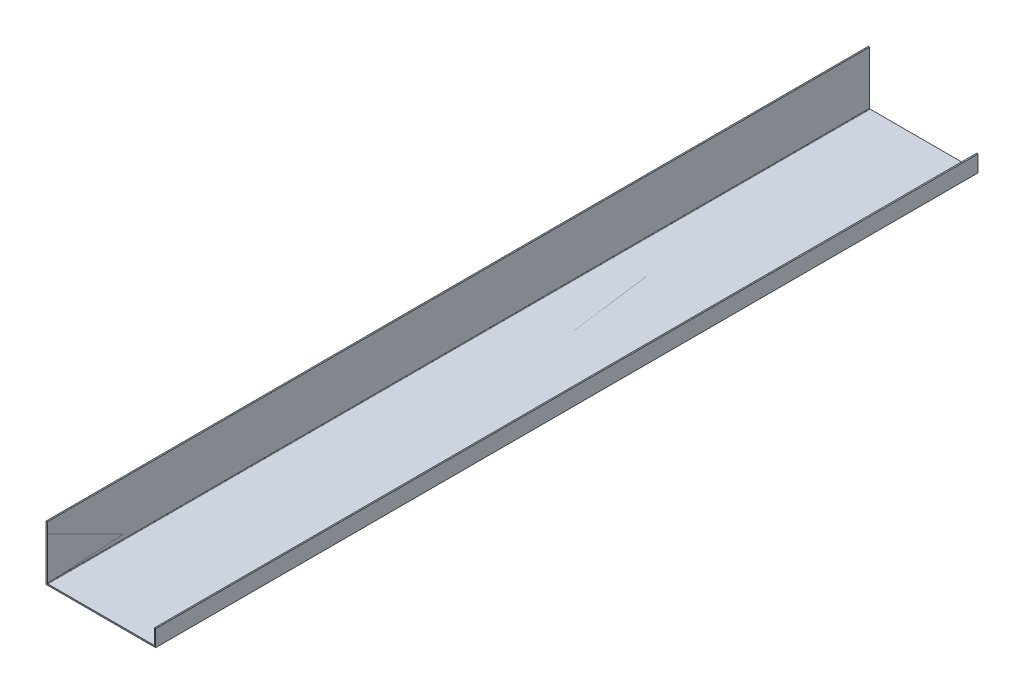
ISO-10303-21;
HEADER;
FILE_DESCRIPTION(('STEP AP214'),'2;1');
FILE_NAME('part.step','',(''),(''),'','','');
FILE_SCHEMA(('AUTOMOTIVE_DESIGN { 1 0 10303 214 1 1 1 1 }'));
ENDSEC;
DATA;
#1=APPLICATION_CONTEXT('core data for automotive mechanical design processes');
#2=APPLICATION_PROTOCOL_DEFINITION('international standard','automotive_design',2000,#1);
#3=PRODUCT_CONTEXT('',#1,'mechanical');
#4=PRODUCT('Part','Part','',(#3));
#5=PRODUCT_RELATED_PRODUCT_CATEGORY('part','',(#4));
#6=PRODUCT_DEFINITION_FORMATION('','',#4);
#7=PRODUCT_DEFINITION_CONTEXT('part definition',#1,'design');
#8=PRODUCT_DEFINITION('design','',#6,#7);
#9=PRODUCT_DEFINITION_SHAPE('','',#8);
#10=(LENGTH_UNIT() NAMED_UNIT(*) SI_UNIT(.MILLI.,.METRE.));
#11=(NAMED_UNIT(*) PLANE_ANGLE_UNIT() SI_UNIT($,.RADIAN.));
#12=(NAMED_UNIT(*) SI_UNIT($,.STERADIAN.) SOLID_ANGLE_UNIT());
#13=UNCERTAINTY_MEASURE_WITH_UNIT(LENGTH_MEASURE(1.E-05),#10,'distance_accuracy_value','');
#14=(GEOMETRIC_REPRESENTATION_CONTEXT(3) GLOBAL_UNCERTAINTY_ASSIGNED_CONTEXT((#13)) GLOBAL_UNIT_ASSIGNED_CONTEXT((#10,
#11,#12)) REPRESENTATION_CONTEXT('',''));
#15=CARTESIAN_POINT('',(0.,0.,0.));
#16=DIRECTION('',(0.,0.,1.));
#17=DIRECTION('',(1.,0.,0.));
#18=AXIS2_PLACEMENT_3D('',#15,#16,#17);
#19=CARTESIAN_POINT('',(1.2,1.19999999999999,0.));
#20=DIRECTION('',(0.,0.,1.));
#21=DIRECTION('',(-1.,0.,0.));
#22=AXIS2_PLACEMENT_3D('',#19,#20,#21);
#23=PLANE('',#22);
#24=DIRECTION('',(0.,1.,0.));
#25=VECTOR('',#24,1.);
#26=CARTESIAN_POINT('',(98.3,1.19999999999999,0.));
#27=LINE('',#26,#25);
#28=CARTESIAN_POINT('',(98.3,0.199999999999988,0.));
#29=VERTEX_POINT('',#28);
#30=CARTESIAN_POINT('',(98.3,1.19999999999999,0.));
#31=VERTEX_POINT('',#30);
#32=EDGE_CURVE('E12',#29,#31,#27,.T.);
#33=ORIENTED_EDGE('',*,*,#32,.F.);
#34=DIRECTION('',(1.,0.,0.));
#35=VECTOR('',#34,1.);
#36=CARTESIAN_POINT('',(1.2,0.199999999999988,0.));
#37=LINE('',#36,#35);
#38=CARTESIAN_POINT('',(1.7,0.199999999999988,0.));
#39=VERTEX_POINT('',#38);
#40=EDGE_CURVE('E105',#29,#39,#37,.F.);
#41=ORIENTED_EDGE('',*,*,#40,.T.);
#42=DIRECTION('',(0.,1.,0.));
#43=VECTOR('',#42,1.);
#44=CARTESIAN_POINT('',(1.7,1.19999999999999,0.));
#45=LINE('',#44,#43);
#46=CARTESIAN_POINT('',(1.7,1.19999999999999,0.));
#47=VERTEX_POINT('',#46);
#48=EDGE_CURVE('E58',#39,#47,#45,.T.);
#49=ORIENTED_EDGE('',*,*,#48,.T.);
#50=DIRECTION('',(-1.,0.,0.));
#51=VECTOR('',#50,1.);
#52=CARTESIAN_POINT('',(1.2,1.19999999999999,0.));
#53=LINE('',#52,#51);
#54=EDGE_CURVE('E107',#31,#47,#53,.T.);
#55=ORIENTED_EDGE('',*,*,#54,.F.);
#56=EDGE_LOOP('',(#33,#41,#49,#55));
#57=FACE_BOUND('',#56,.T.);
#58=ADVANCED_FACE('F48',(#57),#23,.F.);
#59=CARTESIAN_POINT('',(1.7,1.69999999999999,0.));
#60=DIRECTION('',(0.,0.,-1.));
#61=DIRECTION('',(-1.,0.,0.));
#62=AXIS2_PLACEMENT_3D('',#59,#60,#61);
#63=PLANE('',#62);
#64=ORIENTED_EDGE('',*,*,#48,.F.);
#65=CARTESIAN_POINT('',(1.7,1.69999999999999,0.));
#66=DIRECTION('',(0.,0.,1.));
#67=DIRECTION('',(1.,0.,0.));
#68=AXIS2_PLACEMENT_3D('',#65,#66,#67);
#69=CIRCLE('',#68,1.5);
#70=CARTESIAN_POINT('',(0.200000000000003,1.69999999999999,0.));
#71=VERTEX_POINT('',#70);
#72=EDGE_CURVE('E146',#39,#71,#69,.F.);
#73=ORIENTED_EDGE('',*,*,#72,.T.);
#74=DIRECTION('',(1.,0.,0.));
#75=VECTOR('',#74,1.);
#76=CARTESIAN_POINT('',(1.2,1.69999999999999,0.));
#77=LINE('',#76,#75);
#78=CARTESIAN_POINT('',(1.2,1.69999999999999,0.));
#79=VERTEX_POINT('',#78);
#80=EDGE_CURVE('E173',#71,#79,#77,.T.);
#81=ORIENTED_EDGE('',*,*,#80,.T.);
#82=CARTESIAN_POINT('',(1.7,1.69999999999999,0.));
#83=DIRECTION('',(0.,0.,1.));
#84=DIRECTION('',(1.,0.,0.));
#85=AXIS2_PLACEMENT_3D('',#82,#83,#84);
#86=CIRCLE('',#85,0.5);
#87=EDGE_CURVE('E182',#47,#79,#86,.F.);
#88=ORIENTED_EDGE('',*,*,#87,.F.);
#89=EDGE_LOOP('',(#64,#73,#81,#88));
#90=FACE_BOUND('',#89,.T.);
#91=ADVANCED_FACE('F181',(#90),#63,.T.);
#92=CARTESIAN_POINT('',(1.2,50.,0.));
#93=DIRECTION('',(0.,0.,1.));
#94=DIRECTION('',(0.,1.,0.));
#95=AXIS2_PLACEMENT_3D('',#92,#93,#94);
#96=PLANE('',#95);
#97=ORIENTED_EDGE('',*,*,#80,.F.);
#98=DIRECTION('',(0.,-1.,0.));
#99=VECTOR('',#98,1.);
#100=CARTESIAN_POINT('',(0.2,50.,0.));
#101=LINE('',#100,#99);
#102=CARTESIAN_POINT('',(0.2,50.,0.));
#103=VERTEX_POINT('',#102);
#104=EDGE_CURVE('E143',#71,#103,#101,.F.);
#105=ORIENTED_EDGE('',*,*,#104,.T.);
#106=DIRECTION('',(1.,0.,0.));
#107=VECTOR('',#106,1.);
#108=CARTESIAN_POINT('',(1.2,50.,0.));
#109=LINE('',#108,#107);
#110=CARTESIAN_POINT('',(1.2,50.,0.));
#111=VERTEX_POINT('',#110);
#112=EDGE_CURVE('E170',#103,#111,#109,.T.);
#113=ORIENTED_EDGE('',*,*,#112,.T.);
#114=DIRECTION('',(0.,1.,0.));
#115=VECTOR('',#114,1.);
#116=CARTESIAN_POINT('',(1.2,50.,0.));
#117=LINE('',#116,#115);
#118=EDGE_CURVE('E201',#79,#111,#117,.T.);
#119=ORIENTED_EDGE('',*,*,#118,.F.);
#120=EDGE_LOOP('',(#97,#105,#113,#119));
#121=FACE_BOUND('',#120,.T.);
#122=ADVANCED_FACE('F202',(#121),#96,.F.);
#123=CARTESIAN_POINT('',(1.2,50.,750.));
#124=DIRECTION('',(0.,1.,0.));
#125=DIRECTION('',(0.,0.,-1.));
#126=AXIS2_PLACEMENT_3D('',#123,#124,#125);
#127=PLANE('',#126);
#128=ORIENTED_EDGE('',*,*,#112,.F.);
#129=DIRECTION('',(0.,0.,1.));
#130=VECTOR('',#129,1.);
#131=CARTESIAN_POINT('',(0.2,50.,750.));
#132=LINE('',#131,#130);
#133=CARTESIAN_POINT('',(0.2,50.,750.));
#134=VERTEX_POINT('',#133);
#135=EDGE_CURVE('E239',#134,#103,#132,.F.);
#136=ORIENTED_EDGE('',*,*,#135,.F.);
#137=DIRECTION('',(1.,0.,0.));
#138=VECTOR('',#137,1.);
#139=CARTESIAN_POINT('',(1.2,50.,750.));
#140=LINE('',#139,#138);
#141=CARTESIAN_POINT('',(1.2,50.,750.));
#142=VERTEX_POINT('',#141);
#143=EDGE_CURVE('E167',#134,#142,#140,.T.);
#144=ORIENTED_EDGE('',*,*,#143,.T.);
#145=DIRECTION('',(0.,0.,-1.));
#146=VECTOR('',#145,1.);
#147=CARTESIAN_POINT('',(1.2,50.,750.));
#148=LINE('',#147,#146);
#149=EDGE_CURVE('E206',#142,#111,#148,.T.);
#150=ORIENTED_EDGE('',*,*,#149,.T.);
#151=EDGE_LOOP('',(#128,#136,#144,#150));
#152=FACE_BOUND('',#151,.T.);
#153=ADVANCED_FACE('F250',(#152),#127,.T.);
#154=CARTESIAN_POINT('',(1.2,50.,750.));
#155=DIRECTION('',(0.,0.,1.));
#156=DIRECTION('',(0.,1.,0.));
#157=AXIS2_PLACEMENT_3D('',#154,#155,#156);
#158=PLANE('',#157);
#159=ORIENTED_EDGE('',*,*,#143,.F.);
#160=DIRECTION('',(0.,-1.,0.));
#161=VECTOR('',#160,1.);
#162=CARTESIAN_POINT('',(0.2,50.,750.));
#163=LINE('',#162,#161);
#164=CARTESIAN_POINT('',(0.200000000000003,1.69999999999999,750.));
#165=VERTEX_POINT('',#164);
#166=EDGE_CURVE('E136',#165,#134,#163,.F.);
#167=ORIENTED_EDGE('',*,*,#166,.F.);
#168=DIRECTION('',(1.,0.,0.));
#169=VECTOR('',#168,1.);
#170=CARTESIAN_POINT('',(1.2,1.69999999999999,750.));
#171=LINE('',#170,#169);
#172=CARTESIAN_POINT('',(1.2,1.69999999999999,750.));
#173=VERTEX_POINT('',#172);
#174=EDGE_CURVE('E164',#165,#173,#171,.T.);
#175=ORIENTED_EDGE('',*,*,#174,.T.);
#176=DIRECTION('',(0.,1.,0.));
#177=VECTOR('',#176,1.);
#178=CARTESIAN_POINT('',(1.2,50.,750.));
#179=LINE('',#178,#177);
#180=EDGE_CURVE('E212',#173,#142,#179,.T.);
#181=ORIENTED_EDGE('',*,*,#180,.T.);
#182=EDGE_LOOP('',(#159,#167,#175,#181));
#183=FACE_BOUND('',#182,.T.);
#184=ADVANCED_FACE('F300',(#183),#158,.T.);
#185=CARTESIAN_POINT('',(1.7,1.69999999999999,750.));
#186=DIRECTION('',(0.,0.,1.));
#187=DIRECTION('',(1.,0.,0.));
#188=AXIS2_PLACEMENT_3D('',#185,#186,#187);
#189=PLANE('',#188);
#190=ORIENTED_EDGE('',*,*,#174,.F.);
#191=CARTESIAN_POINT('',(1.7,1.69999999999999,750.));
#192=DIRECTION('',(0.,0.,1.));
#193=DIRECTION('',(1.,0.,0.));
#194=AXIS2_PLACEMENT_3D('',#191,#192,#193);
#195=CIRCLE('',#194,1.5);
#196=CARTESIAN_POINT('',(1.7,0.199999999999986,750.));
#197=VERTEX_POINT('',#196);
#198=EDGE_CURVE('E141',#165,#197,#195,.T.);
#199=ORIENTED_EDGE('',*,*,#198,.T.);
#200=DIRECTION('',(0.,1.,0.));
#201=VECTOR('',#200,1.);
#202=CARTESIAN_POINT('',(1.7,1.19999999999999,750.));
#203=LINE('',#202,#201);
#204=CARTESIAN_POINT('',(1.7,1.19999999999999,750.));
#205=VERTEX_POINT('',#204);
#206=EDGE_CURVE('E162',#197,#205,#203,.T.);
#207=ORIENTED_EDGE('',*,*,#206,.T.);
#208=CARTESIAN_POINT('',(1.7,1.69999999999999,750.));
#209=DIRECTION('',(0.,0.,-1.));
#210=DIRECTION('',(-1.,0.,0.));
#211=AXIS2_PLACEMENT_3D('',#208,#209,#210);
#212=CIRCLE('',#211,0.5);
#213=EDGE_CURVE('E198',#173,#205,#212,.F.);
#214=ORIENTED_EDGE('',*,*,#213,.F.);
#215=EDGE_LOOP('',(#190,#199,#207,#214));
#216=FACE_BOUND('',#215,.T.);
#217=ADVANCED_FACE('F302',(#216),#189,.T.);
#218=CARTESIAN_POINT('',(1.2,1.19999999999999,750.));
#219=DIRECTION('',(0.,0.,1.));
#220=DIRECTION('',(-1.,0.,0.));
#221=AXIS2_PLACEMENT_3D('',#218,#219,#220);
#222=PLANE('',#221);
#223=ORIENTED_EDGE('',*,*,#206,.F.);
#224=DIRECTION('',(1.,0.,0.));
#225=VECTOR('',#224,1.);
#226=CARTESIAN_POINT('',(1.2,0.199999999999988,750.));
#227=LINE('',#226,#225);
#228=CARTESIAN_POINT('',(98.3,0.199999999999988,750.));
#229=VERTEX_POINT('',#228);
#230=EDGE_CURVE('E135',#229,#197,#227,.F.);
#231=ORIENTED_EDGE('',*,*,#230,.F.);
#232=DIRECTION('',(0.,1.,0.));
#233=VECTOR('',#232,1.);
#234=CARTESIAN_POINT('',(98.3,1.19999999999999,750.));
#235=LINE('',#234,#233);
#236=CARTESIAN_POINT('',(98.3,1.19999999999999,750.));
#237=VERTEX_POINT('',#236);
#238=EDGE_CURVE('E159',#229,#237,#235,.T.);
#239=ORIENTED_EDGE('',*,*,#238,.T.);
#240=DIRECTION('',(-1.,0.,0.));
#241=VECTOR('',#240,1.);
#242=CARTESIAN_POINT('',(1.2,1.19999999999999,750.));
#243=LINE('',#242,#241);
#244=EDGE_CURVE('E257',#237,#205,#243,.T.);
#245=ORIENTED_EDGE('',*,*,#244,.T.);
#246=EDGE_LOOP('',(#223,#231,#239,#245));
#247=FACE_BOUND('',#246,.T.);
#248=ADVANCED_FACE('F305',(#247),#222,.T.);
#249=CARTESIAN_POINT('',(98.3,1.69999999999999,750.));
#250=DIRECTION('',(0.,0.,1.));
#251=DIRECTION('',(1.,0.,0.));
#252=AXIS2_PLACEMENT_3D('',#249,#250,#251);
#253=PLANE('',#252);
#254=ORIENTED_EDGE('',*,*,#238,.F.);
#255=CARTESIAN_POINT('',(98.3,1.69999999999999,750.));
#256=DIRECTION('',(0.,0.,1.));
#257=DIRECTION('',(1.,0.,0.));
#258=AXIS2_PLACEMENT_3D('',#255,#256,#257);
#259=CIRCLE('',#258,1.5);
#260=CARTESIAN_POINT('',(99.8,1.69999999999999,750.));
#261=VERTEX_POINT('',#260);
#262=EDGE_CURVE('E123',#229,#261,#259,.T.);
#263=ORIENTED_EDGE('',*,*,#262,.T.);
#264=DIRECTION('',(-1.,0.,0.));
#265=VECTOR('',#264,1.);
#266=CARTESIAN_POINT('',(98.8,1.69999999999999,750.));
#267=LINE('',#266,#265);
#268=CARTESIAN_POINT('',(98.8,1.69999999999999,750.));
#269=VERTEX_POINT('',#268);
#270=EDGE_CURVE('E156',#261,#269,#267,.T.);
#271=ORIENTED_EDGE('',*,*,#270,.T.);
#272=CARTESIAN_POINT('',(98.3,1.69999999999999,750.));
#273=DIRECTION('',(0.,0.,-1.));
#274=DIRECTION('',(-1.,0.,0.));
#275=AXIS2_PLACEMENT_3D('',#272,#273,#274);
#276=CIRCLE('',#275,0.5);
#277=EDGE_CURVE('E207',#237,#269,#276,.F.);
#278=ORIENTED_EDGE('',*,*,#277,.F.);
#279=EDGE_LOOP('',(#254,#263,#271,#278));
#280=FACE_BOUND('',#279,.T.);
#281=ADVANCED_FACE('F332',(#280),#253,.T.);
#282=CARTESIAN_POINT('',(98.8,1.19999999999999,750.));
#283=DIRECTION('',(0.,0.,1.));
#284=DIRECTION('',(0.,-1.,0.));
#285=AXIS2_PLACEMENT_3D('',#282,#283,#284);
#286=PLANE('',#285);
#287=ORIENTED_EDGE('',*,*,#270,.F.);
#288=DIRECTION('',(0.,1.,0.));
#289=VECTOR('',#288,1.);
#290=CARTESIAN_POINT('',(99.8,1.19999999999999,750.));
#291=LINE('',#290,#289);
#292=CARTESIAN_POINT('',(99.8,15.,750.));
#293=VERTEX_POINT('',#292);
#294=EDGE_CURVE('E231',#293,#261,#291,.F.);
#295=ORIENTED_EDGE('',*,*,#294,.F.);
#296=DIRECTION('',(-1.,0.,0.));
#297=VECTOR('',#296,1.);
#298=CARTESIAN_POINT('',(98.8,15.,750.));
#299=LINE('',#298,#297);
#300=CARTESIAN_POINT('',(98.8,15.,750.));
#301=VERTEX_POINT('',#300);
#302=EDGE_CURVE('E153',#293,#301,#299,.T.);
#303=ORIENTED_EDGE('',*,*,#302,.T.);
#304=DIRECTION('',(0.,-1.,0.));
#305=VECTOR('',#304,1.);
#306=CARTESIAN_POINT('',(98.8,1.19999999999999,750.));
#307=LINE('',#306,#305);
#308=EDGE_CURVE('E263',#301,#269,#307,.T.);
#309=ORIENTED_EDGE('',*,*,#308,.T.);
#310=EDGE_LOOP('',(#287,#295,#303,#309));
#311=FACE_BOUND('',#310,.T.);
#312=ADVANCED_FACE('F281',(#311),#286,.T.);
#313=CARTESIAN_POINT('',(98.8,15.,750.));
#314=DIRECTION('',(0.,-1.,0.));
#315=DIRECTION('',(0.,0.,-1.));
#316=AXIS2_PLACEMENT_3D('',#313,#314,#315);
#317=PLANE('',#316);
#318=ORIENTED_EDGE('',*,*,#302,.F.);
#319=DIRECTION('',(0.,0.,1.));
#320=VECTOR('',#319,1.);
#321=CARTESIAN_POINT('',(99.8,15.,750.));
#322=LINE('',#321,#320);
#323=CARTESIAN_POINT('',(99.8,15.,0.));
#324=VERTEX_POINT('',#323);
#325=EDGE_CURVE('E128',#293,#324,#322,.F.);
#326=ORIENTED_EDGE('',*,*,#325,.T.);
#327=DIRECTION('',(-1.,0.,0.));
#328=VECTOR('',#327,1.);
#329=CARTESIAN_POINT('',(98.8,15.,0.));
#330=LINE('',#329,#328);
#331=CARTESIAN_POINT('',(98.8,15.,0.));
#332=VERTEX_POINT('',#331);
#333=EDGE_CURVE('E150',#324,#332,#330,.T.);
#334=ORIENTED_EDGE('',*,*,#333,.T.);
#335=DIRECTION('',(0.,0.,-1.));
#336=VECTOR('',#335,1.);
#337=CARTESIAN_POINT('',(98.8,15.,750.));
#338=LINE('',#337,#336);
#339=EDGE_CURVE('E266',#301,#332,#338,.T.);
#340=ORIENTED_EDGE('',*,*,#339,.F.);
#341=EDGE_LOOP('',(#318,#326,#334,#340));
#342=FACE_BOUND('',#341,.T.);
#343=ADVANCED_FACE('F337',(#342),#317,.F.);
#344=CARTESIAN_POINT('',(98.8,1.19999999999999,0.));
#345=DIRECTION('',(0.,0.,1.));
#346=DIRECTION('',(0.,-1.,0.));
#347=AXIS2_PLACEMENT_3D('',#344,#345,#346);
#348=PLANE('',#347);
#349=ORIENTED_EDGE('',*,*,#333,.F.);
#350=DIRECTION('',(0.,1.,0.));
#351=VECTOR('',#350,1.);
#352=CARTESIAN_POINT('',(99.8,1.19999999999999,0.));
#353=LINE('',#352,#351);
#354=CARTESIAN_POINT('',(99.8,1.69999999999999,0.));
#355=VERTEX_POINT('',#354);
#356=EDGE_CURVE('E229',#324,#355,#353,.F.);
#357=ORIENTED_EDGE('',*,*,#356,.T.);
#358=DIRECTION('',(-1.,0.,0.));
#359=VECTOR('',#358,1.);
#360=CARTESIAN_POINT('',(98.8,1.69999999999999,0.));
#361=LINE('',#360,#359);
#362=CARTESIAN_POINT('',(98.8,1.69999999999999,0.));
#363=VERTEX_POINT('',#362);
#364=EDGE_CURVE('E52',#355,#363,#361,.T.);
#365=ORIENTED_EDGE('',*,*,#364,.T.);
#366=DIRECTION('',(0.,-1.,0.));
#367=VECTOR('',#366,1.);
#368=CARTESIAN_POINT('',(98.8,1.19999999999999,0.));
#369=LINE('',#368,#367);
#370=EDGE_CURVE('E260',#332,#363,#369,.T.);
#371=ORIENTED_EDGE('',*,*,#370,.F.);
#372=EDGE_LOOP('',(#349,#357,#365,#371));
#373=FACE_BOUND('',#372,.T.);
#374=ADVANCED_FACE('F291',(#373),#348,.F.);
#375=CARTESIAN_POINT('',(98.3,1.69999999999999,0.));
#376=DIRECTION('',(0.,0.,-1.));
#377=DIRECTION('',(-1.,0.,0.));
#378=AXIS2_PLACEMENT_3D('',#375,#376,#377);
#379=PLANE('',#378);
#380=CARTESIAN_POINT('',(98.3,1.69999999999999,0.));
#381=DIRECTION('',(0.,0.,1.));
#382=DIRECTION('',(1.,0.,0.));
#383=AXIS2_PLACEMENT_3D('',#380,#381,#382);
#384=CIRCLE('',#383,1.5);
#385=EDGE_CURVE('E120',#355,#29,#384,.F.);
#386=ORIENTED_EDGE('',*,*,#385,.T.);
#387=ORIENTED_EDGE('',*,*,#32,.T.);
#388=CARTESIAN_POINT('',(98.3,1.69999999999999,0.));
#389=DIRECTION('',(0.,0.,1.));
#390=DIRECTION('',(1.,0.,0.));
#391=AXIS2_PLACEMENT_3D('',#388,#389,#390);
#392=CIRCLE('',#391,0.5);
#393=EDGE_CURVE('E224',#363,#31,#392,.F.);
#394=ORIENTED_EDGE('',*,*,#393,.F.);
#395=ORIENTED_EDGE('',*,*,#364,.F.);
#396=EDGE_LOOP('',(#386,#387,#394,#395));
#397=FACE_BOUND('',#396,.T.);
#398=ADVANCED_FACE('F50',(#397),#379,.T.);
#399=CARTESIAN_POINT('',(98.8,1.19999999999999,750.));
#400=DIRECTION('',(1.,0.,0.));
#401=DIRECTION('',(0.,1.,0.));
#402=AXIS2_PLACEMENT_3D('',#399,#400,#401);
#403=PLANE('',#402);
#404=ORIENTED_EDGE('',*,*,#370,.T.);
#405=DIRECTION('',(0.,0.,-1.));
#406=VECTOR('',#405,1.);
#407=CARTESIAN_POINT('',(98.8,1.69999999999999,750.));
#408=LINE('',#407,#406);
#409=EDGE_CURVE('E214',#363,#269,#408,.F.);
#410=ORIENTED_EDGE('',*,*,#409,.T.);
#411=ORIENTED_EDGE('',*,*,#308,.F.);
#412=ORIENTED_EDGE('',*,*,#339,.T.);
#413=EDGE_LOOP('',(#404,#410,#411,#412));
#414=FACE_BOUND('',#413,.T.);
#415=ADVANCED_FACE('F286',(#414),#403,.F.);
#416=CARTESIAN_POINT('',(1.2,1.19999999999999,750.));
#417=DIRECTION('',(0.,-1.,0.));
#418=DIRECTION('',(1.,0.,0.));
#419=AXIS2_PLACEMENT_3D('',#416,#417,#418);
#420=PLANE('',#419);
#421=ORIENTED_EDGE('',*,*,#54,.T.);
#422=DIRECTION('',(0.,0.,-1.));
#423=VECTOR('',#422,1.);
#424=CARTESIAN_POINT('',(1.7,1.19999999999999,750.));
#425=LINE('',#424,#423);
#426=EDGE_CURVE('E197',#47,#205,#425,.F.);
#427=ORIENTED_EDGE('',*,*,#426,.T.);
#428=ORIENTED_EDGE('',*,*,#244,.F.);
#429=DIRECTION('',(0.,0.,-1.));
#430=VECTOR('',#429,1.);
#431=CARTESIAN_POINT('',(98.3,1.19999999999999,0.));
#432=LINE('',#431,#430);
#433=EDGE_CURVE('E218',#237,#31,#432,.T.);
#434=ORIENTED_EDGE('',*,*,#433,.T.);
#435=EDGE_LOOP('',(#421,#427,#428,#434));
#436=FACE_BOUND('',#435,.T.);
#437=ADVANCED_FACE('F307',(#436),#420,.F.);
#438=CARTESIAN_POINT('',(1.2,50.,750.));
#439=DIRECTION('',(-1.,0.,0.));
#440=DIRECTION('',(0.,-1.,0.));
#441=AXIS2_PLACEMENT_3D('',#438,#439,#440);
#442=PLANE('',#441);
#443=ORIENTED_EDGE('',*,*,#180,.F.);
#444=DIRECTION('',(0.,0.,-1.));
#445=VECTOR('',#444,1.);
#446=CARTESIAN_POINT('',(1.2,1.69999999999999,0.));
#447=LINE('',#446,#445);
#448=EDGE_CURVE('E195',#173,#79,#447,.T.);
#449=ORIENTED_EDGE('',*,*,#448,.T.);
#450=ORIENTED_EDGE('',*,*,#118,.T.);
#451=ORIENTED_EDGE('',*,*,#149,.F.);
#452=EDGE_LOOP('',(#443,#449,#450,#451));
#453=FACE_BOUND('',#452,.T.);
#454=ADVANCED_FACE('F210',(#453),#442,.F.);
#455=CARTESIAN_POINT('',(98.3,1.69999999999999,750.));
#456=DIRECTION('',(0.,0.,1.));
#457=DIRECTION('',(1.,0.,0.));
#458=AXIS2_PLACEMENT_3D('',#455,#456,#457);
#459=CYLINDRICAL_SURFACE('',#458,0.5);
#460=ORIENTED_EDGE('',*,*,#277,.T.);
#461=ORIENTED_EDGE('',*,*,#409,.F.);
#462=ORIENTED_EDGE('',*,*,#393,.T.);
#463=ORIENTED_EDGE('',*,*,#433,.F.);
#464=EDGE_LOOP('',(#460,#461,#462,#463));
#465=FACE_BOUND('',#464,.T.);
#466=ADVANCED_FACE('F274',(#465),#459,.F.);
#467=CARTESIAN_POINT('',(1.7,1.69999999999999,750.));
#468=DIRECTION('',(0.,0.,1.));
#469=DIRECTION('',(1.,0.,0.));
#470=AXIS2_PLACEMENT_3D('',#467,#468,#469);
#471=CYLINDRICAL_SURFACE('',#470,0.5);
#472=ORIENTED_EDGE('',*,*,#213,.T.);
#473=ORIENTED_EDGE('',*,*,#426,.F.);
#474=ORIENTED_EDGE('',*,*,#87,.T.);
#475=ORIENTED_EDGE('',*,*,#448,.F.);
#476=EDGE_LOOP('',(#472,#473,#474,#475));
#477=FACE_BOUND('',#476,.T.);
#478=ADVANCED_FACE('F193',(#477),#471,.F.);
#479=CARTESIAN_POINT('',(99.8,1.19999999999999,750.));
#480=DIRECTION('',(1.,0.,0.));
#481=DIRECTION('',(0.,1.,0.));
#482=AXIS2_PLACEMENT_3D('',#479,#480,#481);
#483=PLANE('',#482);
#484=ORIENTED_EDGE('',*,*,#356,.F.);
#485=ORIENTED_EDGE('',*,*,#325,.F.);
#486=ORIENTED_EDGE('',*,*,#294,.T.);
#487=DIRECTION('',(0.,0.,1.));
#488=VECTOR('',#487,1.);
#489=CARTESIAN_POINT('',(99.8,1.69999999999999,750.));
#490=LINE('',#489,#488);
#491=EDGE_CURVE('E127',#355,#261,#490,.T.);
#492=ORIENTED_EDGE('',*,*,#491,.F.);
#493=EDGE_LOOP('',(#484,#485,#486,#492));
#494=FACE_BOUND('',#493,.T.);
#495=ADVANCED_FACE('F352',(#494),#483,.T.);
#496=CARTESIAN_POINT('',(1.2,0.199999999999988,750.));
#497=DIRECTION('',(0.,-1.,0.));
#498=DIRECTION('',(1.,0.,0.));
#499=AXIS2_PLACEMENT_3D('',#496,#497,#498);
#500=PLANE('',#499);
#501=ORIENTED_EDGE('',*,*,#40,.F.);
#502=DIRECTION('',(0.,0.,1.));
#503=VECTOR('',#502,1.);
#504=CARTESIAN_POINT('',(98.3,0.199999999999988,750.));
#505=LINE('',#504,#503);
#506=EDGE_CURVE('E117',#229,#29,#505,.F.);
#507=ORIENTED_EDGE('',*,*,#506,.F.);
#508=ORIENTED_EDGE('',*,*,#230,.T.);
#509=DIRECTION('',(0.,0.,1.));
#510=VECTOR('',#509,1.);
#511=CARTESIAN_POINT('',(1.7,0.199999999999988,750.));
#512=LINE('',#511,#510);
#513=EDGE_CURVE('E133',#39,#197,#512,.T.);
#514=ORIENTED_EDGE('',*,*,#513,.F.);
#515=EDGE_LOOP('',(#501,#507,#508,#514));
#516=FACE_BOUND('',#515,.T.);
#517=ADVANCED_FACE('F131',(#516),#500,.T.);
#518=CARTESIAN_POINT('',(0.2,50.,750.));
#519=DIRECTION('',(-1.,0.,0.));
#520=DIRECTION('',(0.,-1.,0.));
#521=AXIS2_PLACEMENT_3D('',#518,#519,#520);
#522=PLANE('',#521);
#523=ORIENTED_EDGE('',*,*,#166,.T.);
#524=ORIENTED_EDGE('',*,*,#135,.T.);
#525=ORIENTED_EDGE('',*,*,#104,.F.);
#526=DIRECTION('',(0.,0.,1.));
#527=VECTOR('',#526,1.);
#528=CARTESIAN_POINT('',(0.200000000000003,1.69999999999999,750.));
#529=LINE('',#528,#527);
#530=EDGE_CURVE('E225',#165,#71,#529,.F.);
#531=ORIENTED_EDGE('',*,*,#530,.F.);
#532=EDGE_LOOP('',(#523,#524,#525,#531));
#533=FACE_BOUND('',#532,.T.);
#534=ADVANCED_FACE('F245',(#533),#522,.T.);
#535=CARTESIAN_POINT('',(98.3,1.69999999999999,750.));
#536=DIRECTION('',(0.,0.,1.));
#537=DIRECTION('',(1.,0.,0.));
#538=AXIS2_PLACEMENT_3D('',#535,#536,#537);
#539=CYLINDRICAL_SURFACE('',#538,1.5);
#540=ORIENTED_EDGE('',*,*,#262,.F.);
#541=ORIENTED_EDGE('',*,*,#506,.T.);
#542=ORIENTED_EDGE('',*,*,#385,.F.);
#543=ORIENTED_EDGE('',*,*,#491,.T.);
#544=EDGE_LOOP('',(#540,#541,#542,#543));
#545=FACE_BOUND('',#544,.T.);
#546=ADVANCED_FACE('F118',(#545),#539,.T.);
#547=CARTESIAN_POINT('',(1.7,1.69999999999999,750.));
#548=DIRECTION('',(0.,0.,1.));
#549=DIRECTION('',(1.,0.,0.));
#550=AXIS2_PLACEMENT_3D('',#547,#548,#549);
#551=CYLINDRICAL_SURFACE('',#550,1.5);
#552=ORIENTED_EDGE('',*,*,#198,.F.);
#553=ORIENTED_EDGE('',*,*,#530,.T.);
#554=ORIENTED_EDGE('',*,*,#72,.F.);
#555=ORIENTED_EDGE('',*,*,#513,.T.);
#556=EDGE_LOOP('',(#552,#553,#554,#555));
#557=FACE_BOUND('',#556,.T.);
#558=ADVANCED_FACE('F342',(#557),#551,.T.);
#559=CLOSED_SHELL('',(#58,#91,#122,#153,#184,#217,#248,#281,#312,#343,#374,#398,#415,#437,#454,
#466,#478,#495,#517,#534,#546,#558));
#560=MANIFOLD_SOLID_BREP('B2',#559);
#561=CARTESIAN_POINT('',(100.,0.,750.));
#562=DIRECTION('',(0.,1.,0.));
#563=DIRECTION('',(-1.,0.,0.));
#564=AXIS2_PLACEMENT_3D('',#561,#562,#563);
#565=PLANE('',#564);
#566=DIRECTION('',(1.,0.,0.));
#567=VECTOR('',#566,1.);
#568=CARTESIAN_POINT('',(100.,0.,0.));
#569=LINE('',#568,#567);
#570=CARTESIAN_POINT('',(0.,0.,0.));
#571=VERTEX_POINT('',#570);
#572=CARTESIAN_POINT('',(100.,0.,0.));
#573=VERTEX_POINT('',#572);
#574=EDGE_CURVE('E655',#571,#573,#569,.T.);
#575=ORIENTED_EDGE('',*,*,#574,.T.);
#576=DIRECTION('',(0.,0.,-1.));
#577=VECTOR('',#576,1.);
#578=CARTESIAN_POINT('',(100.,0.,750.));
#579=LINE('',#578,#577);
#580=CARTESIAN_POINT('',(100.,0.,750.));
#581=VERTEX_POINT('',#580);
#582=EDGE_CURVE('E46',#581,#573,#579,.T.);
#583=ORIENTED_EDGE('',*,*,#582,.F.);
#584=DIRECTION('',(1.,0.,0.));
#585=VECTOR('',#584,1.);
#586=CARTESIAN_POINT('',(100.,0.,750.));
#587=LINE('',#586,#585);
#588=CARTESIAN_POINT('',(0.,0.,750.));
#589=VERTEX_POINT('',#588);
#590=EDGE_CURVE('E669',#589,#581,#587,.T.);
#591=ORIENTED_EDGE('',*,*,#590,.F.);
#592=DIRECTION('',(0.,0.,-1.));
#593=VECTOR('',#592,1.);
#594=CARTESIAN_POINT('',(0.,0.,750.));
#595=LINE('',#594,#593);
#596=EDGE_CURVE('E651',#589,#571,#595,.T.);
#597=ORIENTED_EDGE('',*,*,#596,.T.);
#598=EDGE_LOOP('',(#575,#583,#591,#597));
#599=FACE_BOUND('',#598,.T.);
#600=ADVANCED_FACE('F559',(#599),#565,.F.);
#601=CARTESIAN_POINT('',(100.,15.,750.));
#602=DIRECTION('',(-1.,0.,0.));
#603=DIRECTION('',(0.,-1.,0.));
#604=AXIS2_PLACEMENT_3D('',#601,#602,#603);
#605=PLANE('',#604);
#606=DIRECTION('',(0.,1.,0.));
#607=VECTOR('',#606,1.);
#608=CARTESIAN_POINT('',(100.,15.,0.));
#609=LINE('',#608,#607);
#610=CARTESIAN_POINT('',(100.,15.,0.));
#611=VERTEX_POINT('',#610);
#612=EDGE_CURVE('E658',#573,#611,#609,.T.);
#613=ORIENTED_EDGE('',*,*,#612,.T.);
#614=DIRECTION('',(0.,0.,-1.));
#615=VECTOR('',#614,1.);
#616=CARTESIAN_POINT('',(100.,15.,750.));
#617=LINE('',#616,#615);
#618=CARTESIAN_POINT('',(100.,15.,750.));
#619=VERTEX_POINT('',#618);
#620=EDGE_CURVE('E567',#619,#611,#617,.T.);
#621=ORIENTED_EDGE('',*,*,#620,.F.);
#622=DIRECTION('',(0.,1.,0.));
#623=VECTOR('',#622,1.);
#624=CARTESIAN_POINT('',(100.,15.,750.));
#625=LINE('',#624,#623);
#626=EDGE_CURVE('E618',#581,#619,#625,.T.);
#627=ORIENTED_EDGE('',*,*,#626,.F.);
#628=ORIENTED_EDGE('',*,*,#582,.T.);
#629=EDGE_LOOP('',(#613,#621,#627,#628));
#630=FACE_BOUND('',#629,.T.);
#631=ADVANCED_FACE('F704',(#630),#605,.F.);
#632=CARTESIAN_POINT('',(98.8,15.,750.));
#633=DIRECTION('',(0.,-1.,0.));
#634=DIRECTION('',(0.,0.,-1.));
#635=AXIS2_PLACEMENT_3D('',#632,#633,#634);
#636=PLANE('',#635);
#637=DIRECTION('',(-1.,0.,0.));
#638=VECTOR('',#637,1.);
#639=CARTESIAN_POINT('',(98.8,15.,0.));
#640=LINE('',#639,#638);
#641=CARTESIAN_POINT('',(98.8,15.,0.));
#642=VERTEX_POINT('',#641);
#643=EDGE_CURVE('E660',#611,#642,#640,.T.);
#644=ORIENTED_EDGE('',*,*,#643,.T.);
#645=DIRECTION('',(0.,0.,-1.));
#646=VECTOR('',#645,1.);
#647=CARTESIAN_POINT('',(98.8,15.,750.));
#648=LINE('',#647,#646);
#649=CARTESIAN_POINT('',(98.8,15.,750.));
#650=VERTEX_POINT('',#649);
#651=EDGE_CURVE('E676',#650,#642,#648,.T.);
#652=ORIENTED_EDGE('',*,*,#651,.F.);
#653=DIRECTION('',(-1.,0.,0.));
#654=VECTOR('',#653,1.);
#655=CARTESIAN_POINT('',(98.8,15.,750.));
#656=LINE('',#655,#654);
#657=EDGE_CURVE('E684',#619,#650,#656,.T.);
#658=ORIENTED_EDGE('',*,*,#657,.F.);
#659=ORIENTED_EDGE('',*,*,#620,.T.);
#660=EDGE_LOOP('',(#644,#652,#658,#659));
#661=FACE_BOUND('',#660,.T.);
#662=ADVANCED_FACE('F682',(#661),#636,.F.);
#663=CARTESIAN_POINT('',(98.8,1.19999999999999,750.));
#664=DIRECTION('',(1.,0.,0.));
#665=DIRECTION('',(0.,1.,0.));
#666=AXIS2_PLACEMENT_3D('',#663,#664,#665);
#667=PLANE('',#666);
#668=DIRECTION('',(0.,-1.,0.));
#669=VECTOR('',#668,1.);
#670=CARTESIAN_POINT('',(98.8,1.19999999999999,0.));
#671=LINE('',#670,#669);
#672=CARTESIAN_POINT('',(98.8,1.19999999999999,0.));
#673=VERTEX_POINT('',#672);
#674=EDGE_CURVE('E662',#642,#673,#671,.T.);
#675=ORIENTED_EDGE('',*,*,#674,.T.);
#676=DIRECTION('',(0.,0.,-1.));
#677=VECTOR('',#676,1.);
#678=CARTESIAN_POINT('',(98.8,1.19999999999999,750.));
#679=LINE('',#678,#677);
#680=CARTESIAN_POINT('',(98.8,1.19999999999999,750.));
#681=VERTEX_POINT('',#680);
#682=EDGE_CURVE('E673',#681,#673,#679,.T.);
#683=ORIENTED_EDGE('',*,*,#682,.F.);
#684=DIRECTION('',(0.,-1.,0.));
#685=VECTOR('',#684,1.);
#686=CARTESIAN_POINT('',(98.8,1.19999999999999,750.));
#687=LINE('',#686,#685);
#688=EDGE_CURVE('E696',#650,#681,#687,.T.);
#689=ORIENTED_EDGE('',*,*,#688,.F.);
#690=ORIENTED_EDGE('',*,*,#651,.T.);
#691=EDGE_LOOP('',(#675,#683,#689,#690));
#692=FACE_BOUND('',#691,.T.);
#693=ADVANCED_FACE('F692',(#692),#667,.F.);
#694=CARTESIAN_POINT('',(1.2,1.19999999999999,750.));
#695=DIRECTION('',(0.,-1.,0.));
#696=DIRECTION('',(1.,0.,0.));
#697=AXIS2_PLACEMENT_3D('',#694,#695,#696);
#698=PLANE('',#697);
#699=DIRECTION('',(-1.,0.,0.));
#700=VECTOR('',#699,1.);
#701=CARTESIAN_POINT('',(1.2,1.19999999999999,0.));
#702=LINE('',#701,#700);
#703=CARTESIAN_POINT('',(1.2,1.19999999999999,0.));
#704=VERTEX_POINT('',#703);
#705=EDGE_CURVE('E664',#673,#704,#702,.T.);
#706=ORIENTED_EDGE('',*,*,#705,.T.);
#707=DIRECTION('',(0.,0.,-1.));
#708=VECTOR('',#707,1.);
#709=CARTESIAN_POINT('',(1.2,1.19999999999999,750.));
#710=LINE('',#709,#708);
#711=CARTESIAN_POINT('',(1.2,1.19999999999999,750.));
#712=VERTEX_POINT('',#711);
#713=EDGE_CURVE('E646',#712,#704,#710,.T.);
#714=ORIENTED_EDGE('',*,*,#713,.F.);
#715=DIRECTION('',(-1.,0.,0.));
#716=VECTOR('',#715,1.);
#717=CARTESIAN_POINT('',(1.2,1.19999999999999,750.));
#718=LINE('',#717,#716);
#719=EDGE_CURVE('E637',#681,#712,#718,.T.);
#720=ORIENTED_EDGE('',*,*,#719,.F.);
#721=ORIENTED_EDGE('',*,*,#682,.T.);
#722=EDGE_LOOP('',(#706,#714,#720,#721));
#723=FACE_BOUND('',#722,.T.);
#724=ADVANCED_FACE('F695',(#723),#698,.F.);
#725=CARTESIAN_POINT('',(1.2,50.,750.));
#726=DIRECTION('',(-1.,0.,0.));
#727=DIRECTION('',(0.,-1.,0.));
#728=AXIS2_PLACEMENT_3D('',#725,#726,#727);
#729=PLANE('',#728);
#730=DIRECTION('',(0.,1.,0.));
#731=VECTOR('',#730,1.);
#732=CARTESIAN_POINT('',(1.2,50.,0.));
#733=LINE('',#732,#731);
#734=CARTESIAN_POINT('',(1.2,50.,0.));
#735=VERTEX_POINT('',#734);
#736=EDGE_CURVE('E645',#704,#735,#733,.T.);
#737=ORIENTED_EDGE('',*,*,#736,.T.);
#738=DIRECTION('',(0.,0.,-1.));
#739=VECTOR('',#738,1.);
#740=CARTESIAN_POINT('',(1.2,50.,750.));
#741=LINE('',#740,#739);
#742=CARTESIAN_POINT('',(1.2,50.,750.));
#743=VERTEX_POINT('',#742);
#744=EDGE_CURVE('E642',#743,#735,#741,.T.);
#745=ORIENTED_EDGE('',*,*,#744,.F.);
#746=DIRECTION('',(0.,1.,0.));
#747=VECTOR('',#746,1.);
#748=CARTESIAN_POINT('',(1.2,50.,750.));
#749=LINE('',#748,#747);
#750=EDGE_CURVE('E631',#712,#743,#749,.T.);
#751=ORIENTED_EDGE('',*,*,#750,.F.);
#752=ORIENTED_EDGE('',*,*,#713,.T.);
#753=EDGE_LOOP('',(#737,#745,#751,#752));
#754=FACE_BOUND('',#753,.T.);
#755=ADVANCED_FACE('F643',(#754),#729,.F.);
#756=CARTESIAN_POINT('',(0.,50.,750.));
#757=DIRECTION('',(0.,-1.,0.));
#758=DIRECTION('',(0.,0.,-1.));
#759=AXIS2_PLACEMENT_3D('',#756,#757,#758);
#760=PLANE('',#759);
#761=DIRECTION('',(-1.,0.,0.));
#762=VECTOR('',#761,1.);
#763=CARTESIAN_POINT('',(0.,50.,0.));
#764=LINE('',#763,#762);
#765=CARTESIAN_POINT('',(0.,50.,0.));
#766=VERTEX_POINT('',#765);
#767=EDGE_CURVE('E604',#735,#766,#764,.T.);
#768=ORIENTED_EDGE('',*,*,#767,.T.);
#769=DIRECTION('',(0.,0.,-1.));
#770=VECTOR('',#769,1.);
#771=CARTESIAN_POINT('',(0.,50.,750.));
#772=LINE('',#771,#770);
#773=CARTESIAN_POINT('',(0.,50.,750.));
#774=VERTEX_POINT('',#773);
#775=EDGE_CURVE('E647',#774,#766,#772,.T.);
#776=ORIENTED_EDGE('',*,*,#775,.F.);
#777=DIRECTION('',(-1.,0.,0.));
#778=VECTOR('',#777,1.);
#779=CARTESIAN_POINT('',(0.,50.,750.));
#780=LINE('',#779,#778);
#781=EDGE_CURVE('E635',#743,#774,#780,.T.);
#782=ORIENTED_EDGE('',*,*,#781,.F.);
#783=ORIENTED_EDGE('',*,*,#744,.T.);
#784=EDGE_LOOP('',(#768,#776,#782,#783));
#785=FACE_BOUND('',#784,.T.);
#786=ADVANCED_FACE('F649',(#785),#760,.F.);
#787=CARTESIAN_POINT('',(0.,0.,750.));
#788=DIRECTION('',(1.,0.,0.));
#789=DIRECTION('',(0.,0.,-1.));
#790=AXIS2_PLACEMENT_3D('',#787,#788,#789);
#791=PLANE('',#790);
#792=DIRECTION('',(0.,-1.,0.));
#793=VECTOR('',#792,1.);
#794=CARTESIAN_POINT('',(0.,0.,0.));
#795=LINE('',#794,#793);
#796=EDGE_CURVE('E610',#766,#571,#795,.T.);
#797=ORIENTED_EDGE('',*,*,#796,.T.);
#798=ORIENTED_EDGE('',*,*,#596,.F.);
#799=DIRECTION('',(0.,-1.,0.));
#800=VECTOR('',#799,1.);
#801=CARTESIAN_POINT('',(0.,0.,750.));
#802=LINE('',#801,#800);
#803=EDGE_CURVE('E575',#774,#589,#802,.T.);
#804=ORIENTED_EDGE('',*,*,#803,.F.);
#805=ORIENTED_EDGE('',*,*,#775,.T.);
#806=EDGE_LOOP('',(#797,#798,#804,#805));
#807=FACE_BOUND('',#806,.T.);
#808=ADVANCED_FACE('F720',(#807),#791,.F.);
#809=CARTESIAN_POINT('',(0.,0.,750.));
#810=DIRECTION('',(0.,0.,-1.));
#811=DIRECTION('',(-1.,0.,0.));
#812=AXIS2_PLACEMENT_3D('',#809,#810,#811);
#813=PLANE('',#812);
#814=ORIENTED_EDGE('',*,*,#590,.T.);
#815=ORIENTED_EDGE('',*,*,#626,.T.);
#816=ORIENTED_EDGE('',*,*,#657,.T.);
#817=ORIENTED_EDGE('',*,*,#688,.T.);
#818=ORIENTED_EDGE('',*,*,#719,.T.);
#819=ORIENTED_EDGE('',*,*,#750,.T.);
#820=ORIENTED_EDGE('',*,*,#781,.T.);
#821=ORIENTED_EDGE('',*,*,#803,.T.);
#822=EDGE_LOOP('',(#814,#815,#816,#817,#818,#819,#820,#821));
#823=FACE_BOUND('',#822,.T.);
#824=ADVANCED_FACE('F633',(#823),#813,.F.);
#825=CARTESIAN_POINT('',(0.,0.,0.));
#826=DIRECTION('',(0.,0.,-1.));
#827=DIRECTION('',(-1.,0.,0.));
#828=AXIS2_PLACEMENT_3D('',#825,#826,#827);
#829=PLANE('',#828);
#830=ORIENTED_EDGE('',*,*,#574,.F.);
#831=ORIENTED_EDGE('',*,*,#796,.F.);
#832=ORIENTED_EDGE('',*,*,#767,.F.);
#833=ORIENTED_EDGE('',*,*,#736,.F.);
#834=ORIENTED_EDGE('',*,*,#705,.F.);
#835=ORIENTED_EDGE('',*,*,#674,.F.);
#836=ORIENTED_EDGE('',*,*,#643,.F.);
#837=ORIENTED_EDGE('',*,*,#612,.F.);
#838=EDGE_LOOP('',(#830,#831,#832,#833,#834,#835,#836,#837));
#839=FACE_BOUND('',#838,.T.);
#840=ADVANCED_FACE('F688',(#839),#829,.T.);
#841=CLOSED_SHELL('',(#600,#631,#662,#693,#724,#755,#786,#808,#824,#840));
#842=MANIFOLD_SOLID_BREP('B6_NOT_SHOWN',#841);
#843=ADVANCED_BREP_SHAPE_REPRESENTATION('',(#18,#560,#842),#14);
#844=SHAPE_DEFINITION_REPRESENTATION(#9,#843);
ENDSEC;
END-ISO-10303-21;
